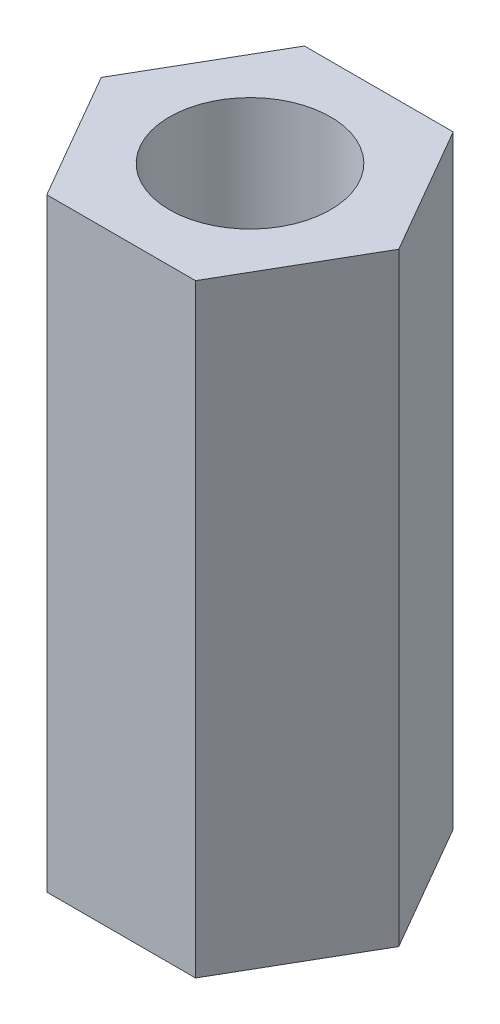
ISO-10303-21;
HEADER;
FILE_DESCRIPTION(('STEP AP214'),'2;1');
FILE_NAME('part.step','',(''),(''),'','','');
FILE_SCHEMA(('AUTOMOTIVE_DESIGN { 1 0 10303 214 1 1 1 1 }'));
ENDSEC;
DATA;
#1=APPLICATION_CONTEXT('core data for automotive mechanical design processes');
#2=APPLICATION_PROTOCOL_DEFINITION('international standard','automotive_design',2000,#1);
#3=PRODUCT_CONTEXT('',#1,'mechanical');
#4=PRODUCT('Part','Part','',(#3));
#5=PRODUCT_RELATED_PRODUCT_CATEGORY('part','',(#4));
#6=PRODUCT_DEFINITION_FORMATION('','',#4);
#7=PRODUCT_DEFINITION_CONTEXT('part definition',#1,'design');
#8=PRODUCT_DEFINITION('design','',#6,#7);
#9=PRODUCT_DEFINITION_SHAPE('','',#8);
#10=(LENGTH_UNIT() NAMED_UNIT(*) SI_UNIT(.MILLI.,.METRE.));
#11=(NAMED_UNIT(*) PLANE_ANGLE_UNIT() SI_UNIT($,.RADIAN.));
#12=(NAMED_UNIT(*) SI_UNIT($,.STERADIAN.) SOLID_ANGLE_UNIT());
#13=UNCERTAINTY_MEASURE_WITH_UNIT(LENGTH_MEASURE(1.E-05),#10,'distance_accuracy_value','');
#14=(GEOMETRIC_REPRESENTATION_CONTEXT(3) GLOBAL_UNCERTAINTY_ASSIGNED_CONTEXT((#13)) GLOBAL_UNIT_ASSIGNED_CONTEXT((#10,
#11,#12)) REPRESENTATION_CONTEXT('',''));
#15=CARTESIAN_POINT('',(0.,0.,0.));
#16=DIRECTION('',(0.,0.,1.));
#17=DIRECTION('',(1.,0.,0.));
#18=AXIS2_PLACEMENT_3D('',#15,#16,#17);
#19=CARTESIAN_POINT('',(0.,30.,0.));
#20=DIRECTION('',(0.,1.,0.));
#21=DIRECTION('',(0.,0.,1.));
#22=AXIS2_PLACEMENT_3D('',#19,#20,#21);
#23=PLANE('',#22);
#24=DIRECTION('',(0.499999999999995,0.,-0.866025403784441));
#25=VECTOR('',#24,1.);
#26=CARTESIAN_POINT('',(-0.930044515265939,30.,3.30823039519674));
#27=LINE('',#26,#25);
#28=CARTESIAN_POINT('',(-0.930044515265939,30.,3.30823039519674));
#29=VERTEX_POINT('',#28);
#30=CARTESIAN_POINT('',(2.7649972075476,30.,-3.09176960480322));
#31=VERTEX_POINT('',#30);
#32=EDGE_CURVE('E143',#29,#31,#27,.T.);
#33=ORIENTED_EDGE('',*,*,#32,.T.);
#34=DIRECTION('',(-0.500000000000001,0.,-0.866025403784438));
#35=VECTOR('',#34,1.);
#36=CARTESIAN_POINT('',(2.7649972075476,30.,-3.09176960480322));
#37=LINE('',#36,#35);
#38=CARTESIAN_POINT('',(-0.930044515266028,30.,-9.49176960480324));
#39=VERTEX_POINT('',#38);
#40=EDGE_CURVE('E101',#31,#39,#37,.T.);
#41=ORIENTED_EDGE('',*,*,#40,.T.);
#42=DIRECTION('',(-1.,0.,0.));
#43=VECTOR('',#42,1.);
#44=CARTESIAN_POINT('',(-0.930044515266028,30.,-9.49176960480324));
#45=LINE('',#44,#43);
#46=CARTESIAN_POINT('',(-8.32012796089326,30.,-9.49176960480321));
#47=VERTEX_POINT('',#46);
#48=EDGE_CURVE('E114',#39,#47,#45,.T.);
#49=ORIENTED_EDGE('',*,*,#48,.T.);
#50=DIRECTION('',(-0.499999999999995,0.,0.866025403784441));
#51=VECTOR('',#50,1.);
#52=CARTESIAN_POINT('',(-8.32012796089326,30.,-9.49176960480321));
#53=LINE('',#52,#51);
#54=CARTESIAN_POINT('',(-12.0151696837068,30.,-3.09176960480317));
#55=VERTEX_POINT('',#54);
#56=EDGE_CURVE('E108',#47,#55,#53,.T.);
#57=ORIENTED_EDGE('',*,*,#56,.T.);
#58=DIRECTION('',(0.500000000000007,0.,0.866025403784434));
#59=VECTOR('',#58,1.);
#60=CARTESIAN_POINT('',(-12.0151696837068,30.,-3.09176960480317));
#61=LINE('',#60,#59);
#62=CARTESIAN_POINT('',(-8.32012796089317,30.,3.30823039519682));
#63=VERTEX_POINT('',#62);
#64=EDGE_CURVE('E112',#55,#63,#61,.T.);
#65=ORIENTED_EDGE('',*,*,#64,.T.);
#66=DIRECTION('',(1.,0.,0.));
#67=VECTOR('',#66,1.);
#68=CARTESIAN_POINT('',(-8.32012796089317,30.,3.30823039519682));
#69=LINE('',#68,#67);
#70=EDGE_CURVE('E64',#63,#29,#69,.T.);
#71=ORIENTED_EDGE('',*,*,#70,.T.);
#72=EDGE_LOOP('',(#33,#41,#49,#57,#65,#71));
#73=FACE_BOUND('',#72,.T.);
#74=CARTESIAN_POINT('',(-4.62508623807962,30.,-3.09176960480322));
#75=DIRECTION('',(0.,1.,0.));
#76=DIRECTION('',(0.,0.,1.));
#77=AXIS2_PLACEMENT_3D('',#74,#75,#76);
#78=CIRCLE('',#77,4.);
#79=CARTESIAN_POINT('',(-4.62508623807962,30.,0.908230395196778));
#80=VERTEX_POINT('',#79);
#81=EDGE_CURVE('E136',#80,#80,#78,.T.);
#82=ORIENTED_EDGE('',*,*,#81,.F.);
#83=EDGE_LOOP('',(#82));
#84=FACE_BOUND('',#83,.T.);
#85=ADVANCED_FACE('F47',(#73,#84),#23,.T.);
#86=CARTESIAN_POINT('',(0.,0.,0.));
#87=DIRECTION('',(0.,1.,0.));
#88=DIRECTION('',(0.,0.,1.));
#89=AXIS2_PLACEMENT_3D('',#86,#87,#88);
#90=PLANE('',#89);
#91=DIRECTION('',(0.499999999999995,0.,-0.866025403784441));
#92=VECTOR('',#91,1.);
#93=CARTESIAN_POINT('',(-0.930044515265939,0.,3.30823039519674));
#94=LINE('',#93,#92);
#95=CARTESIAN_POINT('',(-0.930044515265939,0.,3.30823039519674));
#96=VERTEX_POINT('',#95);
#97=CARTESIAN_POINT('',(2.7649972075476,0.,-3.09176960480322));
#98=VERTEX_POINT('',#97);
#99=EDGE_CURVE('E132',#96,#98,#94,.T.);
#100=ORIENTED_EDGE('',*,*,#99,.F.);
#101=DIRECTION('',(1.,0.,0.));
#102=VECTOR('',#101,1.);
#103=CARTESIAN_POINT('',(-8.32012796089317,0.,3.30823039519682));
#104=LINE('',#103,#102);
#105=CARTESIAN_POINT('',(-8.32012796089317,0.,3.30823039519682));
#106=VERTEX_POINT('',#105);
#107=EDGE_CURVE('E93',#106,#96,#104,.T.);
#108=ORIENTED_EDGE('',*,*,#107,.F.);
#109=DIRECTION('',(0.500000000000007,0.,0.866025403784434));
#110=VECTOR('',#109,1.);
#111=CARTESIAN_POINT('',(-12.0151696837068,0.,-3.09176960480317));
#112=LINE('',#111,#110);
#113=CARTESIAN_POINT('',(-12.0151696837068,0.,-3.09176960480317));
#114=VERTEX_POINT('',#113);
#115=EDGE_CURVE('E87',#114,#106,#112,.T.);
#116=ORIENTED_EDGE('',*,*,#115,.F.);
#117=DIRECTION('',(-0.499999999999995,0.,0.866025403784441));
#118=VECTOR('',#117,1.);
#119=CARTESIAN_POINT('',(-8.32012796089326,0.,-9.49176960480321));
#120=LINE('',#119,#118);
#121=CARTESIAN_POINT('',(-8.32012796089326,0.,-9.49176960480321));
#122=VERTEX_POINT('',#121);
#123=EDGE_CURVE('E122',#122,#114,#120,.T.);
#124=ORIENTED_EDGE('',*,*,#123,.F.);
#125=DIRECTION('',(-1.,0.,0.));
#126=VECTOR('',#125,1.);
#127=CARTESIAN_POINT('',(-0.930044515266028,0.,-9.49176960480324));
#128=LINE('',#127,#126);
#129=CARTESIAN_POINT('',(-0.930044515266028,0.,-9.49176960480324));
#130=VERTEX_POINT('',#129);
#131=EDGE_CURVE('E138',#130,#122,#128,.T.);
#132=ORIENTED_EDGE('',*,*,#131,.F.);
#133=DIRECTION('',(-0.500000000000001,0.,-0.866025403784438));
#134=VECTOR('',#133,1.);
#135=CARTESIAN_POINT('',(2.7649972075476,0.,-3.09176960480322));
#136=LINE('',#135,#134);
#137=EDGE_CURVE('E135',#98,#130,#136,.T.);
#138=ORIENTED_EDGE('',*,*,#137,.F.);
#139=EDGE_LOOP('',(#100,#108,#116,#124,#132,#138));
#140=FACE_BOUND('',#139,.T.);
#141=CARTESIAN_POINT('',(-4.62508623807962,0.,-3.09176960480322));
#142=DIRECTION('',(0.,1.,0.));
#143=DIRECTION('',(0.,0.,1.));
#144=AXIS2_PLACEMENT_3D('',#141,#142,#143);
#145=CIRCLE('',#144,4.);
#146=CARTESIAN_POINT('',(-4.62508623807962,0.,0.908230395196778));
#147=VERTEX_POINT('',#146);
#148=EDGE_CURVE('E272',#147,#147,#145,.T.);
#149=ORIENTED_EDGE('',*,*,#148,.T.);
#150=EDGE_LOOP('',(#149));
#151=FACE_BOUND('',#150,.T.);
#152=ADVANCED_FACE('F152',(#140,#151),#90,.F.);
#153=CARTESIAN_POINT('',(-0.930044515265939,30.,3.30823039519674));
#154=DIRECTION('',(-0.866025403784441,0.,-0.499999999999995));
#155=DIRECTION('',(-0.499999999999995,0.,0.866025403784441));
#156=AXIS2_PLACEMENT_3D('',#153,#154,#155);
#157=PLANE('',#156);
#158=ORIENTED_EDGE('',*,*,#99,.T.);
#159=DIRECTION('',(0.,-1.,0.));
#160=VECTOR('',#159,1.);
#161=CARTESIAN_POINT('',(2.7649972075476,30.,-3.09176960480322));
#162=LINE('',#161,#160);
#163=EDGE_CURVE('E11',#31,#98,#162,.T.);
#164=ORIENTED_EDGE('',*,*,#163,.F.);
#165=ORIENTED_EDGE('',*,*,#32,.F.);
#166=DIRECTION('',(0.,-1.,0.));
#167=VECTOR('',#166,1.);
#168=CARTESIAN_POINT('',(-0.930044515265939,30.,3.30823039519674));
#169=LINE('',#168,#167);
#170=EDGE_CURVE('E128',#29,#96,#169,.T.);
#171=ORIENTED_EDGE('',*,*,#170,.T.);
#172=EDGE_LOOP('',(#158,#164,#165,#171));
#173=FACE_BOUND('',#172,.T.);
#174=ADVANCED_FACE('F49',(#173),#157,.F.);
#175=CARTESIAN_POINT('',(2.7649972075476,30.,-3.09176960480322));
#176=DIRECTION('',(-0.866025403784438,0.,0.500000000000001));
#177=DIRECTION('',(0.500000000000001,0.,0.866025403784438));
#178=AXIS2_PLACEMENT_3D('',#175,#176,#177);
#179=PLANE('',#178);
#180=ORIENTED_EDGE('',*,*,#137,.T.);
#181=DIRECTION('',(0.,-1.,0.));
#182=VECTOR('',#181,1.);
#183=CARTESIAN_POINT('',(-0.930044515266028,30.,-9.49176960480324));
#184=LINE('',#183,#182);
#185=EDGE_CURVE('E56',#39,#130,#184,.T.);
#186=ORIENTED_EDGE('',*,*,#185,.F.);
#187=ORIENTED_EDGE('',*,*,#40,.F.);
#188=ORIENTED_EDGE('',*,*,#163,.T.);
#189=EDGE_LOOP('',(#180,#186,#187,#188));
#190=FACE_BOUND('',#189,.T.);
#191=ADVANCED_FACE('F177',(#190),#179,.F.);
#192=CARTESIAN_POINT('',(-0.930044515266028,30.,-9.49176960480324));
#193=DIRECTION('',(0.,0.,1.));
#194=DIRECTION('',(1.,0.,0.));
#195=AXIS2_PLACEMENT_3D('',#192,#193,#194);
#196=PLANE('',#195);
#197=ORIENTED_EDGE('',*,*,#131,.T.);
#198=DIRECTION('',(0.,-1.,0.));
#199=VECTOR('',#198,1.);
#200=CARTESIAN_POINT('',(-8.32012796089326,30.,-9.49176960480321));
#201=LINE('',#200,#199);
#202=EDGE_CURVE('E123',#47,#122,#201,.T.);
#203=ORIENTED_EDGE('',*,*,#202,.F.);
#204=ORIENTED_EDGE('',*,*,#48,.F.);
#205=ORIENTED_EDGE('',*,*,#185,.T.);
#206=EDGE_LOOP('',(#197,#203,#204,#205));
#207=FACE_BOUND('',#206,.T.);
#208=ADVANCED_FACE('F149',(#207),#196,.F.);
#209=CARTESIAN_POINT('',(-8.32012796089326,30.,-9.49176960480321));
#210=DIRECTION('',(0.866025403784441,0.,0.499999999999995));
#211=DIRECTION('',(0.499999999999995,0.,-0.866025403784441));
#212=AXIS2_PLACEMENT_3D('',#209,#210,#211);
#213=PLANE('',#212);
#214=ORIENTED_EDGE('',*,*,#123,.T.);
#215=DIRECTION('',(0.,-1.,0.));
#216=VECTOR('',#215,1.);
#217=CARTESIAN_POINT('',(-12.0151696837068,30.,-3.09176960480317));
#218=LINE('',#217,#216);
#219=EDGE_CURVE('E119',#55,#114,#218,.T.);
#220=ORIENTED_EDGE('',*,*,#219,.F.);
#221=ORIENTED_EDGE('',*,*,#56,.F.);
#222=ORIENTED_EDGE('',*,*,#202,.T.);
#223=EDGE_LOOP('',(#214,#220,#221,#222));
#224=FACE_BOUND('',#223,.T.);
#225=ADVANCED_FACE('F120',(#224),#213,.F.);
#226=CARTESIAN_POINT('',(-12.0151696837068,30.,-3.09176960480317));
#227=DIRECTION('',(0.866025403784434,0.,-0.500000000000007));
#228=DIRECTION('',(-0.500000000000007,0.,-0.866025403784435));
#229=AXIS2_PLACEMENT_3D('',#226,#227,#228);
#230=PLANE('',#229);
#231=ORIENTED_EDGE('',*,*,#115,.T.);
#232=DIRECTION('',(0.,-1.,0.));
#233=VECTOR('',#232,1.);
#234=CARTESIAN_POINT('',(-8.32012796089317,30.,3.30823039519682));
#235=LINE('',#234,#233);
#236=EDGE_CURVE('E124',#63,#106,#235,.T.);
#237=ORIENTED_EDGE('',*,*,#236,.F.);
#238=ORIENTED_EDGE('',*,*,#64,.F.);
#239=ORIENTED_EDGE('',*,*,#219,.T.);
#240=EDGE_LOOP('',(#231,#237,#238,#239));
#241=FACE_BOUND('',#240,.T.);
#242=ADVANCED_FACE('F126',(#241),#230,.F.);
#243=CARTESIAN_POINT('',(-8.32012796089317,30.,3.30823039519682));
#244=DIRECTION('',(0.,0.,-1.));
#245=DIRECTION('',(-1.,0.,0.));
#246=AXIS2_PLACEMENT_3D('',#243,#244,#245);
#247=PLANE('',#246);
#248=ORIENTED_EDGE('',*,*,#107,.T.);
#249=ORIENTED_EDGE('',*,*,#170,.F.);
#250=ORIENTED_EDGE('',*,*,#70,.F.);
#251=ORIENTED_EDGE('',*,*,#236,.T.);
#252=EDGE_LOOP('',(#248,#249,#250,#251));
#253=FACE_BOUND('',#252,.T.);
#254=ADVANCED_FACE('F157',(#253),#247,.F.);
#255=CARTESIAN_POINT('',(-4.62508623807962,30.,-3.09176960480322));
#256=DIRECTION('',(0.,-1.,0.));
#257=DIRECTION('',(0.,0.,-1.));
#258=AXIS2_PLACEMENT_3D('',#255,#256,#257);
#259=CYLINDRICAL_SURFACE('',#258,4.);
#260=ORIENTED_EDGE('',*,*,#81,.T.);
#261=EDGE_LOOP('',(#260));
#262=FACE_BOUND('',#261,.T.);
#263=ORIENTED_EDGE('',*,*,#148,.F.);
#264=EDGE_LOOP('',(#263));
#265=FACE_BOUND('',#264,.T.);
#266=ADVANCED_FACE('F159',(#262,#265),#259,.F.);
#267=CLOSED_SHELL('',(#85,#152,#174,#191,#208,#225,#242,#254,#266));
#268=MANIFOLD_SOLID_BREP('B2',#267);
#269=ADVANCED_BREP_SHAPE_REPRESENTATION('',(#18,#268),#14);
#270=SHAPE_DEFINITION_REPRESENTATION(#9,#269);
ENDSEC;
END-ISO-10303-21;
